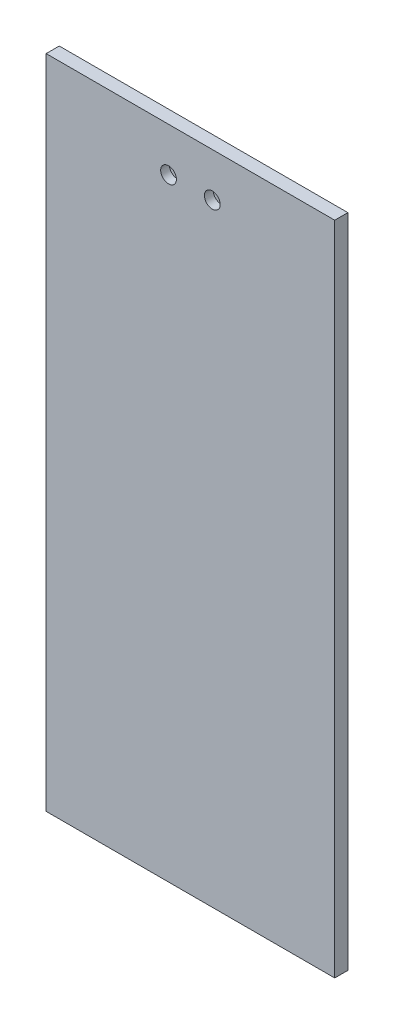
ISO-10303-21;
HEADER;
FILE_DESCRIPTION(('STEP AP214'),'2;1');
FILE_NAME('part.step','',(''),(''),'','','');
FILE_SCHEMA(('AUTOMOTIVE_DESIGN { 1 0 10303 214 1 1 1 1 }'));
ENDSEC;
DATA;
#1=APPLICATION_CONTEXT('core data for automotive mechanical design processes');
#2=APPLICATION_PROTOCOL_DEFINITION('international standard','automotive_design',2000,#1);
#3=PRODUCT_CONTEXT('',#1,'mechanical');
#4=PRODUCT('Part','Part','',(#3));
#5=PRODUCT_RELATED_PRODUCT_CATEGORY('part','',(#4));
#6=PRODUCT_DEFINITION_FORMATION('','',#4);
#7=PRODUCT_DEFINITION_CONTEXT('part definition',#1,'design');
#8=PRODUCT_DEFINITION('design','',#6,#7);
#9=PRODUCT_DEFINITION_SHAPE('','',#8);
#10=(LENGTH_UNIT() NAMED_UNIT(*) SI_UNIT(.MILLI.,.METRE.));
#11=(NAMED_UNIT(*) PLANE_ANGLE_UNIT() SI_UNIT($,.RADIAN.));
#12=(NAMED_UNIT(*) SI_UNIT($,.STERADIAN.) SOLID_ANGLE_UNIT());
#13=UNCERTAINTY_MEASURE_WITH_UNIT(LENGTH_MEASURE(1.E-05),#10,'distance_accuracy_value','');
#14=(GEOMETRIC_REPRESENTATION_CONTEXT(3) GLOBAL_UNCERTAINTY_ASSIGNED_CONTEXT((#13)) GLOBAL_UNIT_ASSIGNED_CONTEXT((#10,
#11,#12)) REPRESENTATION_CONTEXT('',''));
#15=CARTESIAN_POINT('',(0.,0.,0.));
#16=DIRECTION('',(0.,0.,1.));
#17=DIRECTION('',(1.,0.,0.));
#18=AXIS2_PLACEMENT_3D('',#15,#16,#17);
#19=CARTESIAN_POINT('',(0.,150.,-3.));
#20=DIRECTION('',(1.,0.,0.));
#21=DIRECTION('',(0.,0.,-1.));
#22=AXIS2_PLACEMENT_3D('',#19,#20,#21);
#23=PLANE('',#22);
#24=DIRECTION('',(0.,0.,1.));
#25=VECTOR('',#24,1.);
#26=CARTESIAN_POINT('',(0.,0.,-3.));
#27=LINE('',#26,#25);
#28=CARTESIAN_POINT('',(0.,0.,-3.));
#29=VERTEX_POINT('',#28);
#30=CARTESIAN_POINT('',(0.,0.,0.));
#31=VERTEX_POINT('',#30);
#32=EDGE_CURVE('E96',#29,#31,#27,.T.);
#33=ORIENTED_EDGE('',*,*,#32,.T.);
#34=DIRECTION('',(0.,-1.,0.));
#35=VECTOR('',#34,1.);
#36=CARTESIAN_POINT('',(0.,150.,0.));
#37=LINE('',#36,#35);
#38=CARTESIAN_POINT('',(0.,150.,0.));
#39=VERTEX_POINT('',#38);
#40=EDGE_CURVE('E11',#39,#31,#37,.T.);
#41=ORIENTED_EDGE('',*,*,#40,.F.);
#42=DIRECTION('',(0.,0.,1.));
#43=VECTOR('',#42,1.);
#44=CARTESIAN_POINT('',(0.,150.,-3.));
#45=LINE('',#44,#43);
#46=CARTESIAN_POINT('',(0.,150.,-3.));
#47=VERTEX_POINT('',#46);
#48=EDGE_CURVE('E84',#47,#39,#45,.T.);
#49=ORIENTED_EDGE('',*,*,#48,.F.);
#50=DIRECTION('',(0.,-1.,0.));
#51=VECTOR('',#50,1.);
#52=CARTESIAN_POINT('',(0.,150.,-3.));
#53=LINE('',#52,#51);
#54=EDGE_CURVE('E92',#47,#29,#53,.T.);
#55=ORIENTED_EDGE('',*,*,#54,.T.);
#56=EDGE_LOOP('',(#33,#41,#49,#55));
#57=FACE_BOUND('',#56,.T.);
#58=ADVANCED_FACE('F33',(#57),#23,.F.);
#59=CARTESIAN_POINT('',(0.,150.,0.));
#60=DIRECTION('',(0.,0.,-1.));
#61=DIRECTION('',(-1.,0.,0.));
#62=AXIS2_PLACEMENT_3D('',#59,#60,#61);
#63=PLANE('',#62);
#64=CARTESIAN_POINT('',(27.98,140.,0.));
#65=DIRECTION('',(0.,0.,1.));
#66=DIRECTION('',(1.,0.,0.));
#67=AXIS2_PLACEMENT_3D('',#64,#65,#66);
#68=CIRCLE('',#67,1.8);
#69=CARTESIAN_POINT('',(29.78,140.,0.));
#70=VERTEX_POINT('',#69);
#71=EDGE_CURVE('E116',#70,#70,#68,.T.);
#72=ORIENTED_EDGE('',*,*,#71,.F.);
#73=EDGE_LOOP('',(#72));
#74=FACE_BOUND('',#73,.T.);
#75=CARTESIAN_POINT('',(37.98,140.,0.));
#76=DIRECTION('',(0.,0.,1.));
#77=DIRECTION('',(1.,0.,0.));
#78=AXIS2_PLACEMENT_3D('',#75,#76,#77);
#79=CIRCLE('',#78,1.79999999999999);
#80=CARTESIAN_POINT('',(39.78,140.,0.));
#81=VERTEX_POINT('',#80);
#82=EDGE_CURVE('E110',#81,#81,#79,.T.);
#83=ORIENTED_EDGE('',*,*,#82,.F.);
#84=EDGE_LOOP('',(#83));
#85=FACE_BOUND('',#84,.T.);
#86=DIRECTION('',(1.,0.,0.));
#87=VECTOR('',#86,1.);
#88=CARTESIAN_POINT('',(0.,0.,0.));
#89=LINE('',#88,#87);
#90=CARTESIAN_POINT('',(65.96,0.,0.));
#91=VERTEX_POINT('',#90);
#92=EDGE_CURVE('E88',#31,#91,#89,.T.);
#93=ORIENTED_EDGE('',*,*,#92,.T.);
#94=DIRECTION('',(0.,-1.,0.));
#95=VECTOR('',#94,1.);
#96=CARTESIAN_POINT('',(65.96,150.,0.));
#97=LINE('',#96,#95);
#98=CARTESIAN_POINT('',(65.96,150.,0.));
#99=VERTEX_POINT('',#98);
#100=EDGE_CURVE('E41',#99,#91,#97,.T.);
#101=ORIENTED_EDGE('',*,*,#100,.F.);
#102=DIRECTION('',(1.,0.,0.));
#103=VECTOR('',#102,1.);
#104=CARTESIAN_POINT('',(0.,150.,0.));
#105=LINE('',#104,#103);
#106=EDGE_CURVE('E79',#39,#99,#105,.T.);
#107=ORIENTED_EDGE('',*,*,#106,.F.);
#108=ORIENTED_EDGE('',*,*,#40,.T.);
#109=EDGE_LOOP('',(#93,#101,#107,#108));
#110=FACE_BOUND('',#109,.T.);
#111=ADVANCED_FACE('F87',(#74,#85,#110),#63,.F.);
#112=CARTESIAN_POINT('',(65.96,150.,0.));
#113=DIRECTION('',(-1.,0.,0.));
#114=DIRECTION('',(0.,0.,1.));
#115=AXIS2_PLACEMENT_3D('',#112,#113,#114);
#116=PLANE('',#115);
#117=DIRECTION('',(0.,0.,-1.));
#118=VECTOR('',#117,1.);
#119=CARTESIAN_POINT('',(65.96,0.,0.));
#120=LINE('',#119,#118);
#121=CARTESIAN_POINT('',(65.96,0.,-3.));
#122=VERTEX_POINT('',#121);
#123=EDGE_CURVE('E66',#91,#122,#120,.T.);
#124=ORIENTED_EDGE('',*,*,#123,.T.);
#125=DIRECTION('',(0.,-1.,0.));
#126=VECTOR('',#125,1.);
#127=CARTESIAN_POINT('',(65.96,150.,-3.));
#128=LINE('',#127,#126);
#129=CARTESIAN_POINT('',(65.96,150.,-3.));
#130=VERTEX_POINT('',#129);
#131=EDGE_CURVE('E89',#130,#122,#128,.T.);
#132=ORIENTED_EDGE('',*,*,#131,.F.);
#133=DIRECTION('',(0.,0.,-1.));
#134=VECTOR('',#133,1.);
#135=CARTESIAN_POINT('',(65.96,150.,0.));
#136=LINE('',#135,#134);
#137=EDGE_CURVE('E82',#99,#130,#136,.T.);
#138=ORIENTED_EDGE('',*,*,#137,.F.);
#139=ORIENTED_EDGE('',*,*,#100,.T.);
#140=EDGE_LOOP('',(#124,#132,#138,#139));
#141=FACE_BOUND('',#140,.T.);
#142=ADVANCED_FACE('F90',(#141),#116,.F.);
#143=CARTESIAN_POINT('',(65.96,150.,-3.));
#144=DIRECTION('',(0.,0.,1.));
#145=DIRECTION('',(1.,0.,0.));
#146=AXIS2_PLACEMENT_3D('',#143,#144,#145);
#147=PLANE('',#146);
#148=DIRECTION('',(-1.,0.,0.));
#149=VECTOR('',#148,1.);
#150=CARTESIAN_POINT('',(65.96,0.,-3.));
#151=LINE('',#150,#149);
#152=EDGE_CURVE('E72',#122,#29,#151,.T.);
#153=ORIENTED_EDGE('',*,*,#152,.T.);
#154=ORIENTED_EDGE('',*,*,#54,.F.);
#155=DIRECTION('',(-1.,0.,0.));
#156=VECTOR('',#155,1.);
#157=CARTESIAN_POINT('',(65.96,150.,-3.));
#158=LINE('',#157,#156);
#159=EDGE_CURVE('E49',#130,#47,#158,.T.);
#160=ORIENTED_EDGE('',*,*,#159,.F.);
#161=ORIENTED_EDGE('',*,*,#131,.T.);
#162=EDGE_LOOP('',(#153,#154,#160,#161));
#163=FACE_BOUND('',#162,.T.);
#164=ADVANCED_FACE('F104',(#163),#147,.F.);
#165=CARTESIAN_POINT('',(0.,150.,0.));
#166=DIRECTION('',(0.,1.,0.));
#167=DIRECTION('',(0.,0.,1.));
#168=AXIS2_PLACEMENT_3D('',#165,#166,#167);
#169=PLANE('',#168);
#170=ORIENTED_EDGE('',*,*,#48,.T.);
#171=ORIENTED_EDGE('',*,*,#106,.T.);
#172=ORIENTED_EDGE('',*,*,#137,.T.);
#173=ORIENTED_EDGE('',*,*,#159,.T.);
#174=EDGE_LOOP('',(#170,#171,#172,#173));
#175=FACE_BOUND('',#174,.T.);
#176=ADVANCED_FACE('F80',(#175),#169,.T.);
#177=CARTESIAN_POINT('',(0.,0.,0.));
#178=DIRECTION('',(0.,1.,0.));
#179=DIRECTION('',(0.,0.,1.));
#180=AXIS2_PLACEMENT_3D('',#177,#178,#179);
#181=PLANE('',#180);
#182=ORIENTED_EDGE('',*,*,#32,.F.);
#183=ORIENTED_EDGE('',*,*,#152,.F.);
#184=ORIENTED_EDGE('',*,*,#123,.F.);
#185=ORIENTED_EDGE('',*,*,#92,.F.);
#186=EDGE_LOOP('',(#182,#183,#184,#185));
#187=FACE_BOUND('',#186,.T.);
#188=ADVANCED_FACE('F107',(#187),#181,.F.);
#189=CARTESIAN_POINT('',(37.98,140.,-2.));
#190=DIRECTION('',(0.,0.,1.));
#191=DIRECTION('',(1.,0.,0.));
#192=AXIS2_PLACEMENT_3D('',#189,#190,#191);
#193=CYLINDRICAL_SURFACE('',#192,1.79999999999999);
#194=CARTESIAN_POINT('',(37.98,140.,-2.));
#195=DIRECTION('',(0.,0.,1.));
#196=DIRECTION('',(1.,0.,0.));
#197=AXIS2_PLACEMENT_3D('',#194,#195,#196);
#198=CIRCLE('',#197,1.79999999999999);
#199=CARTESIAN_POINT('',(39.78,140.,-2.));
#200=VERTEX_POINT('',#199);
#201=EDGE_CURVE('E113',#200,#200,#198,.T.);
#202=ORIENTED_EDGE('',*,*,#201,.F.);
#203=EDGE_LOOP('',(#202));
#204=FACE_BOUND('',#203,.T.);
#205=ORIENTED_EDGE('',*,*,#82,.T.);
#206=EDGE_LOOP('',(#205));
#207=FACE_BOUND('',#206,.T.);
#208=ADVANCED_FACE('F135',(#204,#207),#193,.F.);
#209=CARTESIAN_POINT('',(37.98,140.,-2.));
#210=DIRECTION('',(0.,0.,1.));
#211=DIRECTION('',(1.,0.,0.));
#212=AXIS2_PLACEMENT_3D('',#209,#210,#211);
#213=PLANE('',#212);
#214=ORIENTED_EDGE('',*,*,#201,.T.);
#215=EDGE_LOOP('',(#214));
#216=FACE_BOUND('',#215,.T.);
#217=ADVANCED_FACE('F127',(#216),#213,.T.);
#218=CARTESIAN_POINT('',(27.98,140.,-2.));
#219=DIRECTION('',(0.,0.,1.));
#220=DIRECTION('',(1.,0.,0.));
#221=AXIS2_PLACEMENT_3D('',#218,#219,#220);
#222=CYLINDRICAL_SURFACE('',#221,1.8);
#223=CARTESIAN_POINT('',(27.98,140.,-2.));
#224=DIRECTION('',(0.,0.,1.));
#225=DIRECTION('',(1.,0.,0.));
#226=AXIS2_PLACEMENT_3D('',#223,#224,#225);
#227=CIRCLE('',#226,1.8);
#228=CARTESIAN_POINT('',(29.78,140.,-2.));
#229=VERTEX_POINT('',#228);
#230=EDGE_CURVE('E99',#229,#229,#227,.T.);
#231=ORIENTED_EDGE('',*,*,#230,.F.);
#232=EDGE_LOOP('',(#231));
#233=FACE_BOUND('',#232,.T.);
#234=ORIENTED_EDGE('',*,*,#71,.T.);
#235=EDGE_LOOP('',(#234));
#236=FACE_BOUND('',#235,.T.);
#237=ADVANCED_FACE('F124',(#233,#236),#222,.F.);
#238=CARTESIAN_POINT('',(27.98,140.,-2.));
#239=DIRECTION('',(0.,0.,1.));
#240=DIRECTION('',(1.,0.,0.));
#241=AXIS2_PLACEMENT_3D('',#238,#239,#240);
#242=PLANE('',#241);
#243=ORIENTED_EDGE('',*,*,#230,.T.);
#244=EDGE_LOOP('',(#243));
#245=FACE_BOUND('',#244,.T.);
#246=ADVANCED_FACE('F122',(#245),#242,.T.);
#247=CLOSED_SHELL('',(#58,#111,#142,#164,#176,#188,#208,#217,#237,#246));
#248=MANIFOLD_SOLID_BREP('B2',#247);
#249=ADVANCED_BREP_SHAPE_REPRESENTATION('',(#18,#248),#14);
#250=SHAPE_DEFINITION_REPRESENTATION(#9,#249);
ENDSEC;
END-ISO-10303-21;
